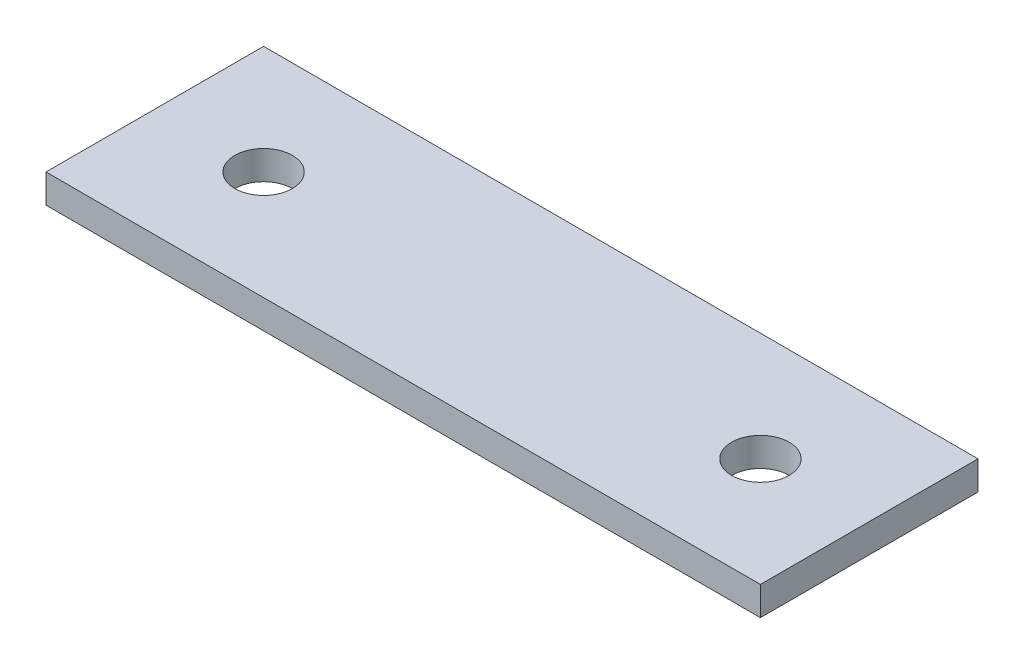
ISO-10303-21;
HEADER;
FILE_DESCRIPTION(('STEP AP214'),'2;1');
FILE_NAME('part.step','',(''),(''),'','','');
FILE_SCHEMA(('AUTOMOTIVE_DESIGN { 1 0 10303 214 1 1 1 1 }'));
ENDSEC;
DATA;
#1=APPLICATION_CONTEXT('core data for automotive mechanical design processes');
#2=APPLICATION_PROTOCOL_DEFINITION('international standard','automotive_design',2000,#1);
#3=PRODUCT_CONTEXT('',#1,'mechanical');
#4=PRODUCT('Part','Part','',(#3));
#5=PRODUCT_RELATED_PRODUCT_CATEGORY('part','',(#4));
#6=PRODUCT_DEFINITION_FORMATION('','',#4);
#7=PRODUCT_DEFINITION_CONTEXT('part definition',#1,'design');
#8=PRODUCT_DEFINITION('design','',#6,#7);
#9=PRODUCT_DEFINITION_SHAPE('','',#8);
#10=(LENGTH_UNIT() NAMED_UNIT(*) SI_UNIT(.MILLI.,.METRE.));
#11=(NAMED_UNIT(*) PLANE_ANGLE_UNIT() SI_UNIT($,.RADIAN.));
#12=(NAMED_UNIT(*) SI_UNIT($,.STERADIAN.) SOLID_ANGLE_UNIT());
#13=UNCERTAINTY_MEASURE_WITH_UNIT(LENGTH_MEASURE(1.E-05),#10,'distance_accuracy_value','');
#14=(GEOMETRIC_REPRESENTATION_CONTEXT(3) GLOBAL_UNCERTAINTY_ASSIGNED_CONTEXT((#13)) GLOBAL_UNIT_ASSIGNED_CONTEXT((#10,
#11,#12)) REPRESENTATION_CONTEXT('',''));
#15=CARTESIAN_POINT('',(0.,0.,0.));
#16=DIRECTION('',(0.,0.,1.));
#17=DIRECTION('',(1.,0.,0.));
#18=AXIS2_PLACEMENT_3D('',#15,#16,#17);
#19=CARTESIAN_POINT('',(0.,0.79375,0.));
#20=DIRECTION('',(0.,1.,0.));
#21=DIRECTION('',(0.,0.,1.));
#22=AXIS2_PLACEMENT_3D('',#19,#20,#21);
#23=PLANE('',#22);
#24=CARTESIAN_POINT('',(-13.7,0.79375,0.));
#25=DIRECTION('',(0.,1.,0.));
#26=DIRECTION('',(0.,0.,1.));
#27=AXIS2_PLACEMENT_3D('',#24,#25,#26);
#28=CIRCLE('',#27,1.5875);
#29=CARTESIAN_POINT('',(-13.7,0.79375,1.5875));
#30=VERTEX_POINT('',#29);
#31=EDGE_CURVE('E100',#30,#30,#28,.T.);
#32=ORIENTED_EDGE('',*,*,#31,.F.);
#33=EDGE_LOOP('',(#32));
#34=FACE_BOUND('',#33,.T.);
#35=DIRECTION('',(0.,0.,1.));
#36=VECTOR('',#35,1.);
#37=CARTESIAN_POINT('',(-19.7,0.79375,6.));
#38=LINE('',#37,#36);
#39=CARTESIAN_POINT('',(-19.7,0.79375,-6.));
#40=VERTEX_POINT('',#39);
#41=CARTESIAN_POINT('',(-19.7,0.79375,6.));
#42=VERTEX_POINT('',#41);
#43=EDGE_CURVE('E85',#40,#42,#38,.T.);
#44=ORIENTED_EDGE('',*,*,#43,.T.);
#45=DIRECTION('',(1.,0.,0.));
#46=VECTOR('',#45,1.);
#47=CARTESIAN_POINT('',(19.7,0.79375,6.));
#48=LINE('',#47,#46);
#49=CARTESIAN_POINT('',(19.7,0.79375,6.));
#50=VERTEX_POINT('',#49);
#51=EDGE_CURVE('E80',#42,#50,#48,.T.);
#52=ORIENTED_EDGE('',*,*,#51,.T.);
#53=DIRECTION('',(0.,0.,-1.));
#54=VECTOR('',#53,1.);
#55=CARTESIAN_POINT('',(19.7,0.79375,6.));
#56=LINE('',#55,#54);
#57=CARTESIAN_POINT('',(19.7,0.79375,-6.));
#58=VERTEX_POINT('',#57);
#59=EDGE_CURVE('E83',#50,#58,#56,.T.);
#60=ORIENTED_EDGE('',*,*,#59,.T.);
#61=DIRECTION('',(-1.,0.,0.));
#62=VECTOR('',#61,1.);
#63=CARTESIAN_POINT('',(19.7,0.79375,-6.));
#64=LINE('',#63,#62);
#65=EDGE_CURVE('E50',#58,#40,#64,.T.);
#66=ORIENTED_EDGE('',*,*,#65,.T.);
#67=EDGE_LOOP('',(#44,#52,#60,#66));
#68=FACE_BOUND('',#67,.T.);
#69=CARTESIAN_POINT('',(13.7,0.79375,0.));
#70=DIRECTION('',(0.,1.,0.));
#71=DIRECTION('',(0.,0.,1.));
#72=AXIS2_PLACEMENT_3D('',#69,#70,#71);
#73=CIRCLE('',#72,1.5875);
#74=CARTESIAN_POINT('',(13.7,0.79375,1.5875));
#75=VERTEX_POINT('',#74);
#76=EDGE_CURVE('E115',#75,#75,#73,.T.);
#77=ORIENTED_EDGE('',*,*,#76,.F.);
#78=EDGE_LOOP('',(#77));
#79=FACE_BOUND('',#78,.T.);
#80=ADVANCED_FACE('F33',(#34,#68,#79),#23,.T.);
#81=CARTESIAN_POINT('',(0.,-0.79375,0.));
#82=DIRECTION('',(0.,1.,0.));
#83=DIRECTION('',(0.,0.,1.));
#84=AXIS2_PLACEMENT_3D('',#81,#82,#83);
#85=PLANE('',#84);
#86=CARTESIAN_POINT('',(-13.7,-0.79375,0.));
#87=DIRECTION('',(0.,1.,0.));
#88=DIRECTION('',(0.,0.,1.));
#89=AXIS2_PLACEMENT_3D('',#86,#87,#88);
#90=CIRCLE('',#89,1.5875);
#91=CARTESIAN_POINT('',(-13.7,-0.79375,1.5875));
#92=VERTEX_POINT('',#91);
#93=EDGE_CURVE('E112',#92,#92,#90,.T.);
#94=ORIENTED_EDGE('',*,*,#93,.T.);
#95=EDGE_LOOP('',(#94));
#96=FACE_BOUND('',#95,.T.);
#97=DIRECTION('',(0.,0.,1.));
#98=VECTOR('',#97,1.);
#99=CARTESIAN_POINT('',(-19.7,-0.79375,6.));
#100=LINE('',#99,#98);
#101=CARTESIAN_POINT('',(-19.7,-0.79375,-6.));
#102=VERTEX_POINT('',#101);
#103=CARTESIAN_POINT('',(-19.7,-0.79375,6.));
#104=VERTEX_POINT('',#103);
#105=EDGE_CURVE('E97',#102,#104,#100,.T.);
#106=ORIENTED_EDGE('',*,*,#105,.F.);
#107=DIRECTION('',(-1.,0.,0.));
#108=VECTOR('',#107,1.);
#109=CARTESIAN_POINT('',(19.7,-0.79375,-6.));
#110=LINE('',#109,#108);
#111=CARTESIAN_POINT('',(19.7,-0.79375,-6.));
#112=VERTEX_POINT('',#111);
#113=EDGE_CURVE('E73',#112,#102,#110,.T.);
#114=ORIENTED_EDGE('',*,*,#113,.F.);
#115=DIRECTION('',(0.,0.,-1.));
#116=VECTOR('',#115,1.);
#117=CARTESIAN_POINT('',(19.7,-0.79375,6.));
#118=LINE('',#117,#116);
#119=CARTESIAN_POINT('',(19.7,-0.79375,6.));
#120=VERTEX_POINT('',#119);
#121=EDGE_CURVE('E67',#120,#112,#118,.T.);
#122=ORIENTED_EDGE('',*,*,#121,.F.);
#123=DIRECTION('',(1.,0.,0.));
#124=VECTOR('',#123,1.);
#125=CARTESIAN_POINT('',(19.7,-0.79375,6.));
#126=LINE('',#125,#124);
#127=EDGE_CURVE('E89',#104,#120,#126,.T.);
#128=ORIENTED_EDGE('',*,*,#127,.F.);
#129=EDGE_LOOP('',(#106,#114,#122,#128));
#130=FACE_BOUND('',#129,.T.);
#131=CARTESIAN_POINT('',(13.7,-0.79375,0.));
#132=DIRECTION('',(0.,1.,0.));
#133=DIRECTION('',(0.,0.,1.));
#134=AXIS2_PLACEMENT_3D('',#131,#132,#133);
#135=CIRCLE('',#134,1.5875);
#136=CARTESIAN_POINT('',(13.7,-0.79375,1.5875));
#137=VERTEX_POINT('',#136);
#138=EDGE_CURVE('E118',#137,#137,#135,.T.);
#139=ORIENTED_EDGE('',*,*,#138,.T.);
#140=EDGE_LOOP('',(#139));
#141=FACE_BOUND('',#140,.T.);
#142=ADVANCED_FACE('F108',(#96,#130,#141),#85,.F.);
#143=CARTESIAN_POINT('',(-19.7,0.79375,6.));
#144=DIRECTION('',(1.,0.,0.));
#145=DIRECTION('',(0.,0.,-1.));
#146=AXIS2_PLACEMENT_3D('',#143,#144,#145);
#147=PLANE('',#146);
#148=ORIENTED_EDGE('',*,*,#105,.T.);
#149=DIRECTION('',(0.,-1.,0.));
#150=VECTOR('',#149,1.);
#151=CARTESIAN_POINT('',(-19.7,0.79375,6.));
#152=LINE('',#151,#150);
#153=EDGE_CURVE('E11',#42,#104,#152,.T.);
#154=ORIENTED_EDGE('',*,*,#153,.F.);
#155=ORIENTED_EDGE('',*,*,#43,.F.);
#156=DIRECTION('',(0.,-1.,0.));
#157=VECTOR('',#156,1.);
#158=CARTESIAN_POINT('',(-19.7,0.79375,-6.));
#159=LINE('',#158,#157);
#160=EDGE_CURVE('E93',#40,#102,#159,.T.);
#161=ORIENTED_EDGE('',*,*,#160,.T.);
#162=EDGE_LOOP('',(#148,#154,#155,#161));
#163=FACE_BOUND('',#162,.T.);
#164=ADVANCED_FACE('F35',(#163),#147,.F.);
#165=CARTESIAN_POINT('',(19.7,0.79375,6.));
#166=DIRECTION('',(0.,0.,-1.));
#167=DIRECTION('',(-1.,0.,0.));
#168=AXIS2_PLACEMENT_3D('',#165,#166,#167);
#169=PLANE('',#168);
#170=ORIENTED_EDGE('',*,*,#127,.T.);
#171=DIRECTION('',(0.,-1.,0.));
#172=VECTOR('',#171,1.);
#173=CARTESIAN_POINT('',(19.7,0.79375,6.));
#174=LINE('',#173,#172);
#175=EDGE_CURVE('E42',#50,#120,#174,.T.);
#176=ORIENTED_EDGE('',*,*,#175,.F.);
#177=ORIENTED_EDGE('',*,*,#51,.F.);
#178=ORIENTED_EDGE('',*,*,#153,.T.);
#179=EDGE_LOOP('',(#170,#176,#177,#178));
#180=FACE_BOUND('',#179,.T.);
#181=ADVANCED_FACE('F88',(#180),#169,.F.);
#182=CARTESIAN_POINT('',(19.7,0.79375,6.));
#183=DIRECTION('',(-1.,0.,0.));
#184=DIRECTION('',(0.,0.,1.));
#185=AXIS2_PLACEMENT_3D('',#182,#183,#184);
#186=PLANE('',#185);
#187=ORIENTED_EDGE('',*,*,#121,.T.);
#188=DIRECTION('',(0.,-1.,0.));
#189=VECTOR('',#188,1.);
#190=CARTESIAN_POINT('',(19.7,0.79375,-6.));
#191=LINE('',#190,#189);
#192=EDGE_CURVE('E90',#58,#112,#191,.T.);
#193=ORIENTED_EDGE('',*,*,#192,.F.);
#194=ORIENTED_EDGE('',*,*,#59,.F.);
#195=ORIENTED_EDGE('',*,*,#175,.T.);
#196=EDGE_LOOP('',(#187,#193,#194,#195));
#197=FACE_BOUND('',#196,.T.);
#198=ADVANCED_FACE('F91',(#197),#186,.F.);
#199=CARTESIAN_POINT('',(19.7,0.79375,-6.));
#200=DIRECTION('',(0.,0.,1.));
#201=DIRECTION('',(1.,0.,0.));
#202=AXIS2_PLACEMENT_3D('',#199,#200,#201);
#203=PLANE('',#202);
#204=ORIENTED_EDGE('',*,*,#113,.T.);
#205=ORIENTED_EDGE('',*,*,#160,.F.);
#206=ORIENTED_EDGE('',*,*,#65,.F.);
#207=ORIENTED_EDGE('',*,*,#192,.T.);
#208=EDGE_LOOP('',(#204,#205,#206,#207));
#209=FACE_BOUND('',#208,.T.);
#210=ADVANCED_FACE('F105',(#209),#203,.F.);
#211=CARTESIAN_POINT('',(-13.7,0.79375,0.));
#212=DIRECTION('',(0.,-1.,0.));
#213=DIRECTION('',(0.,0.,-1.));
#214=AXIS2_PLACEMENT_3D('',#211,#212,#213);
#215=CYLINDRICAL_SURFACE('',#214,1.5875);
#216=ORIENTED_EDGE('',*,*,#31,.T.);
#217=EDGE_LOOP('',(#216));
#218=FACE_BOUND('',#217,.T.);
#219=ORIENTED_EDGE('',*,*,#93,.F.);
#220=EDGE_LOOP('',(#219));
#221=FACE_BOUND('',#220,.T.);
#222=ADVANCED_FACE('F136',(#218,#221),#215,.F.);
#223=CARTESIAN_POINT('',(13.7,0.79375,0.));
#224=DIRECTION('',(0.,-1.,0.));
#225=DIRECTION('',(0.,0.,-1.));
#226=AXIS2_PLACEMENT_3D('',#223,#224,#225);
#227=CYLINDRICAL_SURFACE('',#226,1.5875);
#228=ORIENTED_EDGE('',*,*,#76,.T.);
#229=EDGE_LOOP('',(#228));
#230=FACE_BOUND('',#229,.T.);
#231=ORIENTED_EDGE('',*,*,#138,.F.);
#232=EDGE_LOOP('',(#231));
#233=FACE_BOUND('',#232,.T.);
#234=ADVANCED_FACE('F124',(#230,#233),#227,.F.);
#235=CLOSED_SHELL('',(#80,#142,#164,#181,#198,#210,#222,#234));
#236=MANIFOLD_SOLID_BREP('B2',#235);
#237=ADVANCED_BREP_SHAPE_REPRESENTATION('',(#18,#236),#14);
#238=SHAPE_DEFINITION_REPRESENTATION(#9,#237);
ENDSEC;
END-ISO-10303-21;
